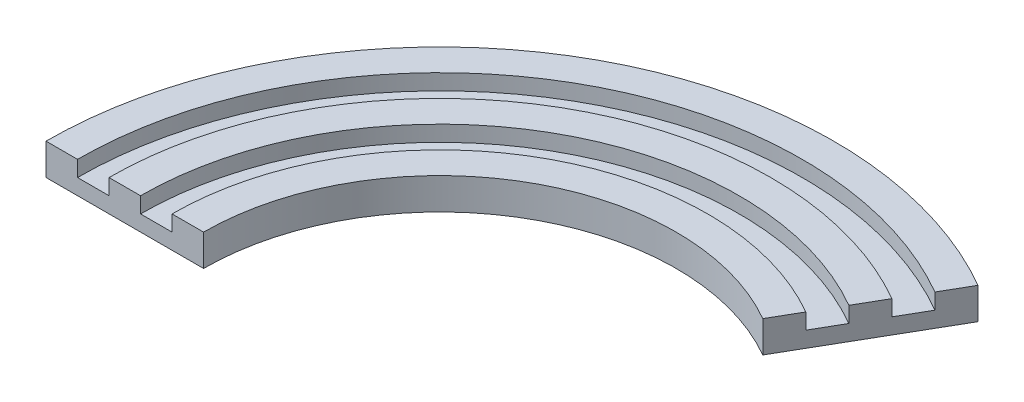
ISO-10303-21;
HEADER;
FILE_DESCRIPTION(('STEP AP214'),'2;1');
FILE_NAME('part.step','',(''),(''),'','','');
FILE_SCHEMA(('AUTOMOTIVE_DESIGN { 1 0 10303 214 1 1 1 1 }'));
ENDSEC;
DATA;
#1=APPLICATION_CONTEXT('core data for automotive mechanical design processes');
#2=APPLICATION_PROTOCOL_DEFINITION('international standard','automotive_design',2000,#1);
#3=PRODUCT_CONTEXT('',#1,'mechanical');
#4=PRODUCT('Part','Part','',(#3));
#5=PRODUCT_RELATED_PRODUCT_CATEGORY('part','',(#4));
#6=PRODUCT_DEFINITION_FORMATION('','',#4);
#7=PRODUCT_DEFINITION_CONTEXT('part definition',#1,'design');
#8=PRODUCT_DEFINITION('design','',#6,#7);
#9=PRODUCT_DEFINITION_SHAPE('','',#8);
#10=(LENGTH_UNIT() NAMED_UNIT(*) SI_UNIT(.MILLI.,.METRE.));
#11=(NAMED_UNIT(*) PLANE_ANGLE_UNIT() SI_UNIT($,.RADIAN.));
#12=(NAMED_UNIT(*) SI_UNIT($,.STERADIAN.) SOLID_ANGLE_UNIT());
#13=UNCERTAINTY_MEASURE_WITH_UNIT(LENGTH_MEASURE(1.E-05),#10,'distance_accuracy_value','');
#14=(GEOMETRIC_REPRESENTATION_CONTEXT(3) GLOBAL_UNCERTAINTY_ASSIGNED_CONTEXT((#13)) GLOBAL_UNIT_ASSIGNED_CONTEXT((#10,
#11,#12)) REPRESENTATION_CONTEXT('',''));
#15=CARTESIAN_POINT('',(0.,0.,0.));
#16=DIRECTION('',(0.,0.,1.));
#17=DIRECTION('',(1.,0.,0.));
#18=AXIS2_PLACEMENT_3D('',#15,#16,#17);
#19=CARTESIAN_POINT('',(0.,0.,0.));
#20=DIRECTION('',(0.,0.,-1.));
#21=DIRECTION('',(-1.,0.,0.));
#22=AXIS2_PLACEMENT_3D('',#19,#20,#21);
#23=PLANE('',#22);
#24=DIRECTION('',(-1.,0.,0.));
#25=VECTOR('',#24,1.);
#26=CARTESIAN_POINT('',(-15.,5.,0.));
#27=LINE('',#26,#25);
#28=CARTESIAN_POINT('',(-15.,5.,0.));
#29=VERTEX_POINT('',#28);
#30=CARTESIAN_POINT('',(-25.,5.,0.));
#31=VERTEX_POINT('',#30);
#32=EDGE_CURVE('E133',#29,#31,#27,.T.);
#33=ORIENTED_EDGE('',*,*,#32,.T.);
#34=DIRECTION('',(0.,-1.,0.));
#35=VECTOR('',#34,1.);
#36=CARTESIAN_POINT('',(-25.,-5.,0.));
#37=LINE('',#36,#35);
#38=CARTESIAN_POINT('',(-25.,-5.,0.));
#39=VERTEX_POINT('',#38);
#40=EDGE_CURVE('E140',#31,#39,#37,.T.);
#41=ORIENTED_EDGE('',*,*,#40,.T.);
#42=DIRECTION('',(1.,0.,0.));
#43=VECTOR('',#42,1.);
#44=CARTESIAN_POINT('',(25.,-4.99999999999999,0.));
#45=LINE('',#44,#43);
#46=CARTESIAN_POINT('',(25.,-4.99999999999999,0.));
#47=VERTEX_POINT('',#46);
#48=EDGE_CURVE('E150',#39,#47,#45,.T.);
#49=ORIENTED_EDGE('',*,*,#48,.T.);
#50=DIRECTION('',(0.,1.,0.));
#51=VECTOR('',#50,1.);
#52=CARTESIAN_POINT('',(25.,-4.99999999999999,0.));
#53=LINE('',#52,#51);
#54=CARTESIAN_POINT('',(25.,5.,0.));
#55=VERTEX_POINT('',#54);
#56=EDGE_CURVE('E159',#47,#55,#53,.T.);
#57=ORIENTED_EDGE('',*,*,#56,.T.);
#58=DIRECTION('',(-1.,0.,0.));
#59=VECTOR('',#58,1.);
#60=CARTESIAN_POINT('',(25.,5.,0.));
#61=LINE('',#60,#59);
#62=CARTESIAN_POINT('',(15.,5.,0.));
#63=VERTEX_POINT('',#62);
#64=EDGE_CURVE('E167',#55,#63,#61,.T.);
#65=ORIENTED_EDGE('',*,*,#64,.T.);
#66=DIRECTION('',(0.,-1.,0.));
#67=VECTOR('',#66,1.);
#68=CARTESIAN_POINT('',(15.,5.,0.));
#69=LINE('',#68,#67);
#70=CARTESIAN_POINT('',(15.,0.,0.));
#71=VERTEX_POINT('',#70);
#72=EDGE_CURVE('E175',#63,#71,#69,.T.);
#73=ORIENTED_EDGE('',*,*,#72,.T.);
#74=DIRECTION('',(-1.,0.,0.));
#75=VECTOR('',#74,1.);
#76=CARTESIAN_POINT('',(15.,0.,0.));
#77=LINE('',#76,#75);
#78=CARTESIAN_POINT('',(5.00000000000001,0.,0.));
#79=VERTEX_POINT('',#78);
#80=EDGE_CURVE('E183',#71,#79,#77,.T.);
#81=ORIENTED_EDGE('',*,*,#80,.T.);
#82=DIRECTION('',(0.,1.,0.));
#83=VECTOR('',#82,1.);
#84=CARTESIAN_POINT('',(5.00000000000001,5.,0.));
#85=LINE('',#84,#83);
#86=CARTESIAN_POINT('',(5.00000000000001,5.,0.));
#87=VERTEX_POINT('',#86);
#88=EDGE_CURVE('E191',#79,#87,#85,.T.);
#89=ORIENTED_EDGE('',*,*,#88,.T.);
#90=DIRECTION('',(-1.,0.,0.));
#91=VECTOR('',#90,1.);
#92=CARTESIAN_POINT('',(5.00000000000001,5.,0.));
#93=LINE('',#92,#91);
#94=CARTESIAN_POINT('',(-4.99999999999999,5.,0.));
#95=VERTEX_POINT('',#94);
#96=EDGE_CURVE('E199',#87,#95,#93,.T.);
#97=ORIENTED_EDGE('',*,*,#96,.T.);
#98=DIRECTION('',(0.,-1.,0.));
#99=VECTOR('',#98,1.);
#100=CARTESIAN_POINT('',(-5.,5.,0.));
#101=LINE('',#100,#99);
#102=CARTESIAN_POINT('',(-4.99999999999999,0.,0.));
#103=VERTEX_POINT('',#102);
#104=EDGE_CURVE('E79',#95,#103,#101,.T.);
#105=ORIENTED_EDGE('',*,*,#104,.T.);
#106=DIRECTION('',(-1.,0.,0.));
#107=VECTOR('',#106,1.);
#108=CARTESIAN_POINT('',(-15.,0.,0.));
#109=LINE('',#108,#107);
#110=CARTESIAN_POINT('',(-15.,0.,0.));
#111=VERTEX_POINT('',#110);
#112=EDGE_CURVE('E74',#103,#111,#109,.T.);
#113=ORIENTED_EDGE('',*,*,#112,.T.);
#114=DIRECTION('',(0.,1.,0.));
#115=VECTOR('',#114,1.);
#116=CARTESIAN_POINT('',(-15.,5.,0.));
#117=LINE('',#116,#115);
#118=EDGE_CURVE('E68',#111,#29,#117,.T.);
#119=ORIENTED_EDGE('',*,*,#118,.T.);
#120=EDGE_LOOP('',(#33,#41,#49,#57,#65,#73,#81,#89,#97,#105,#113,#119));
#121=FACE_BOUND('',#120,.T.);
#122=ADVANCED_FACE('F32',(#121),#23,.F.);
#123=CARTESIAN_POINT('',(150.000000000001,0.,-86.6025403784433));
#124=DIRECTION('',(0.866025403784433,0.,0.50000000000001));
#125=DIRECTION('',(0.50000000000001,0.,-0.866025403784433));
#126=AXIS2_PLACEMENT_3D('',#123,#124,#125);
#127=PLANE('',#126);
#128=DIRECTION('',(0.50000000000001,0.,-0.866025403784433));
#129=VECTOR('',#128,1.);
#130=CARTESIAN_POINT('',(157.500000000001,5.,-99.5929214352098));
#131=LINE('',#130,#129);
#132=CARTESIAN_POINT('',(157.500000000001,5.,-99.5929214352098));
#133=VERTEX_POINT('',#132);
#134=CARTESIAN_POINT('',(162.500000000001,5.,-108.253175473054));
#135=VERTEX_POINT('',#134);
#136=EDGE_CURVE('E144',#133,#135,#131,.T.);
#137=ORIENTED_EDGE('',*,*,#136,.F.);
#138=DIRECTION('',(0.,1.,0.));
#139=VECTOR('',#138,1.);
#140=CARTESIAN_POINT('',(157.500000000001,5.,-99.5929214352098));
#141=LINE('',#140,#139);
#142=CARTESIAN_POINT('',(157.500000000001,0.,-99.5929214352098));
#143=VERTEX_POINT('',#142);
#144=EDGE_CURVE('E11',#143,#133,#141,.T.);
#145=ORIENTED_EDGE('',*,*,#144,.F.);
#146=DIRECTION('',(0.50000000000001,0.,-0.866025403784433));
#147=VECTOR('',#146,1.);
#148=CARTESIAN_POINT('',(157.500000000001,0.,-99.5929214352098));
#149=LINE('',#148,#147);
#150=CARTESIAN_POINT('',(152.500000000001,0.,-90.9326673973654));
#151=VERTEX_POINT('',#150);
#152=EDGE_CURVE('E46',#151,#143,#149,.T.);
#153=ORIENTED_EDGE('',*,*,#152,.F.);
#154=DIRECTION('',(0.,-1.,0.));
#155=VECTOR('',#154,1.);
#156=CARTESIAN_POINT('',(152.500000000001,5.,-90.9326673973654));
#157=LINE('',#156,#155);
#158=CARTESIAN_POINT('',(152.500000000001,5.,-90.9326673973654));
#159=VERTEX_POINT('',#158);
#160=EDGE_CURVE('E55',#159,#151,#157,.T.);
#161=ORIENTED_EDGE('',*,*,#160,.F.);
#162=DIRECTION('',(0.50000000000001,0.,-0.866025403784433));
#163=VECTOR('',#162,1.);
#164=CARTESIAN_POINT('',(147.500000000001,5.,-82.2724133595211));
#165=LINE('',#164,#163);
#166=CARTESIAN_POINT('',(147.500000000001,5.,-82.2724133595211));
#167=VERTEX_POINT('',#166);
#168=EDGE_CURVE('E204',#167,#159,#165,.T.);
#169=ORIENTED_EDGE('',*,*,#168,.F.);
#170=DIRECTION('',(0.,1.,0.));
#171=VECTOR('',#170,1.);
#172=CARTESIAN_POINT('',(147.500000000001,5.,-82.2724133595211));
#173=LINE('',#172,#171);
#174=CARTESIAN_POINT('',(147.500000000001,0.,-82.2724133595211));
#175=VERTEX_POINT('',#174);
#176=EDGE_CURVE('E196',#175,#167,#173,.T.);
#177=ORIENTED_EDGE('',*,*,#176,.F.);
#178=DIRECTION('',(0.50000000000001,0.,-0.866025403784433));
#179=VECTOR('',#178,1.);
#180=CARTESIAN_POINT('',(142.500000000001,0.,-73.6121593216768));
#181=LINE('',#180,#179);
#182=CARTESIAN_POINT('',(142.500000000001,0.,-73.6121593216768));
#183=VERTEX_POINT('',#182);
#184=EDGE_CURVE('E188',#183,#175,#181,.T.);
#185=ORIENTED_EDGE('',*,*,#184,.F.);
#186=DIRECTION('',(0.,-1.,0.));
#187=VECTOR('',#186,1.);
#188=CARTESIAN_POINT('',(142.500000000001,5.,-73.6121593216768));
#189=LINE('',#188,#187);
#190=CARTESIAN_POINT('',(142.500000000001,5.,-73.6121593216768));
#191=VERTEX_POINT('',#190);
#192=EDGE_CURVE('E180',#191,#183,#189,.T.);
#193=ORIENTED_EDGE('',*,*,#192,.F.);
#194=DIRECTION('',(0.50000000000001,0.,-0.866025403784433));
#195=VECTOR('',#194,1.);
#196=CARTESIAN_POINT('',(137.500000000001,5.,-64.9519052838325));
#197=LINE('',#196,#195);
#198=CARTESIAN_POINT('',(137.500000000001,5.,-64.9519052838325));
#199=VERTEX_POINT('',#198);
#200=EDGE_CURVE('E172',#199,#191,#197,.T.);
#201=ORIENTED_EDGE('',*,*,#200,.F.);
#202=DIRECTION('',(0.,1.,0.));
#203=VECTOR('',#202,1.);
#204=CARTESIAN_POINT('',(137.500000000001,-4.99999999999999,-64.9519052838325));
#205=LINE('',#204,#203);
#206=CARTESIAN_POINT('',(137.500000000001,-4.99999999999999,-64.9519052838325));
#207=VERTEX_POINT('',#206);
#208=EDGE_CURVE('E164',#207,#199,#205,.T.);
#209=ORIENTED_EDGE('',*,*,#208,.F.);
#210=DIRECTION('',(-0.50000000000001,0.,0.866025403784433));
#211=VECTOR('',#210,1.);
#212=CARTESIAN_POINT('',(137.500000000001,-4.99999999999999,-64.9519052838325));
#213=LINE('',#212,#211);
#214=CARTESIAN_POINT('',(162.500000000001,-5.,-108.253175473054));
#215=VERTEX_POINT('',#214);
#216=EDGE_CURVE('E156',#215,#207,#213,.T.);
#217=ORIENTED_EDGE('',*,*,#216,.F.);
#218=DIRECTION('',(0.,-1.,0.));
#219=VECTOR('',#218,1.);
#220=CARTESIAN_POINT('',(162.500000000001,-5.,-108.253175473054));
#221=LINE('',#220,#219);
#222=EDGE_CURVE('E151',#135,#215,#221,.T.);
#223=ORIENTED_EDGE('',*,*,#222,.F.);
#224=EDGE_LOOP('',(#137,#145,#153,#161,#169,#177,#185,#193,#201,#209,#217,#223));
#225=FACE_BOUND('',#224,.T.);
#226=ADVANCED_FACE('F227',(#225),#127,.T.);
#227=CARTESIAN_POINT('',(-15.,5.,0.));
#228=DIRECTION('',(0.,-1.,0.));
#229=DIRECTION('',(0.,0.,-1.));
#230=AXIS2_PLACEMENT_3D('',#227,#228,#229);
#231=PLANE('',#230);
#232=CARTESIAN_POINT('',(100.,5.,0.));
#233=DIRECTION('',(0.,-1.,0.));
#234=DIRECTION('',(-1.,0.,0.));
#235=AXIS2_PLACEMENT_3D('',#232,#233,#234);
#236=CIRCLE('',#235,125.);
#237=EDGE_CURVE('E137',#31,#135,#236,.T.);
#238=ORIENTED_EDGE('',*,*,#237,.F.);
#239=ORIENTED_EDGE('',*,*,#32,.F.);
#240=CARTESIAN_POINT('',(100.,5.,0.));
#241=DIRECTION('',(0.,-1.,0.));
#242=DIRECTION('',(-1.,0.,0.));
#243=AXIS2_PLACEMENT_3D('',#240,#241,#242);
#244=CIRCLE('',#243,115.);
#245=EDGE_CURVE('E135',#29,#133,#244,.T.);
#246=ORIENTED_EDGE('',*,*,#245,.T.);
#247=ORIENTED_EDGE('',*,*,#136,.T.);
#248=EDGE_LOOP('',(#238,#239,#246,#247));
#249=FACE_BOUND('',#248,.T.);
#250=ADVANCED_FACE('F134',(#249),#231,.F.);
#251=CARTESIAN_POINT('',(100.,0.,0.));
#252=DIRECTION('',(0.,-1.,0.));
#253=DIRECTION('',(0.,0.,-1.));
#254=AXIS2_PLACEMENT_3D('',#251,#252,#253);
#255=CYLINDRICAL_SURFACE('',#254,125.);
#256=CARTESIAN_POINT('',(100.,-5.,0.));
#257=DIRECTION('',(0.,-1.,0.));
#258=DIRECTION('',(-1.,0.,0.));
#259=AXIS2_PLACEMENT_3D('',#256,#257,#258);
#260=CIRCLE('',#259,125.);
#261=EDGE_CURVE('E153',#39,#215,#260,.T.);
#262=ORIENTED_EDGE('',*,*,#261,.F.);
#263=ORIENTED_EDGE('',*,*,#40,.F.);
#264=ORIENTED_EDGE('',*,*,#237,.T.);
#265=ORIENTED_EDGE('',*,*,#222,.T.);
#266=EDGE_LOOP('',(#262,#263,#264,#265));
#267=FACE_BOUND('',#266,.T.);
#268=ADVANCED_FACE('F234',(#267),#255,.T.);
#269=CARTESIAN_POINT('',(25.,-5.,0.));
#270=DIRECTION('',(0.,1.,0.));
#271=DIRECTION('',(0.,0.,1.));
#272=AXIS2_PLACEMENT_3D('',#269,#270,#271);
#273=PLANE('',#272);
#274=CARTESIAN_POINT('',(100.,-4.99999999999999,0.));
#275=DIRECTION('',(0.,-1.,0.));
#276=DIRECTION('',(-1.,0.,0.));
#277=AXIS2_PLACEMENT_3D('',#274,#275,#276);
#278=CIRCLE('',#277,75.);
#279=EDGE_CURVE('E161',#47,#207,#278,.T.);
#280=ORIENTED_EDGE('',*,*,#279,.F.);
#281=ORIENTED_EDGE('',*,*,#48,.F.);
#282=ORIENTED_EDGE('',*,*,#261,.T.);
#283=ORIENTED_EDGE('',*,*,#216,.T.);
#284=EDGE_LOOP('',(#280,#281,#282,#283));
#285=FACE_BOUND('',#284,.T.);
#286=ADVANCED_FACE('F244',(#285),#273,.F.);
#287=CARTESIAN_POINT('',(100.,0.,0.));
#288=DIRECTION('',(0.,-1.,0.));
#289=DIRECTION('',(0.,0.,-1.));
#290=AXIS2_PLACEMENT_3D('',#287,#288,#289);
#291=CYLINDRICAL_SURFACE('',#290,75.);
#292=CARTESIAN_POINT('',(100.,5.,0.));
#293=DIRECTION('',(0.,-1.,0.));
#294=DIRECTION('',(-1.,0.,0.));
#295=AXIS2_PLACEMENT_3D('',#292,#293,#294);
#296=CIRCLE('',#295,75.);
#297=EDGE_CURVE('E169',#55,#199,#296,.T.);
#298=ORIENTED_EDGE('',*,*,#297,.F.);
#299=ORIENTED_EDGE('',*,*,#56,.F.);
#300=ORIENTED_EDGE('',*,*,#279,.T.);
#301=ORIENTED_EDGE('',*,*,#208,.T.);
#302=EDGE_LOOP('',(#298,#299,#300,#301));
#303=FACE_BOUND('',#302,.T.);
#304=ADVANCED_FACE('F246',(#303),#291,.F.);
#305=CARTESIAN_POINT('',(25.,5.,0.));
#306=DIRECTION('',(0.,-1.,0.));
#307=DIRECTION('',(0.,0.,-1.));
#308=AXIS2_PLACEMENT_3D('',#305,#306,#307);
#309=PLANE('',#308);
#310=CARTESIAN_POINT('',(100.,5.,0.));
#311=DIRECTION('',(0.,-1.,0.));
#312=DIRECTION('',(-1.,0.,0.));
#313=AXIS2_PLACEMENT_3D('',#310,#311,#312);
#314=CIRCLE('',#313,85.);
#315=EDGE_CURVE('E177',#63,#191,#314,.T.);
#316=ORIENTED_EDGE('',*,*,#315,.F.);
#317=ORIENTED_EDGE('',*,*,#64,.F.);
#318=ORIENTED_EDGE('',*,*,#297,.T.);
#319=ORIENTED_EDGE('',*,*,#200,.T.);
#320=EDGE_LOOP('',(#316,#317,#318,#319));
#321=FACE_BOUND('',#320,.T.);
#322=ADVANCED_FACE('F250',(#321),#309,.F.);
#323=CARTESIAN_POINT('',(100.,0.,0.));
#324=DIRECTION('',(0.,-1.,0.));
#325=DIRECTION('',(0.,0.,-1.));
#326=AXIS2_PLACEMENT_3D('',#323,#324,#325);
#327=CYLINDRICAL_SURFACE('',#326,85.);
#328=CARTESIAN_POINT('',(100.,0.,0.));
#329=DIRECTION('',(0.,-1.,0.));
#330=DIRECTION('',(-1.,0.,0.));
#331=AXIS2_PLACEMENT_3D('',#328,#329,#330);
#332=CIRCLE('',#331,85.);
#333=EDGE_CURVE('E185',#71,#183,#332,.T.);
#334=ORIENTED_EDGE('',*,*,#333,.F.);
#335=ORIENTED_EDGE('',*,*,#72,.F.);
#336=ORIENTED_EDGE('',*,*,#315,.T.);
#337=ORIENTED_EDGE('',*,*,#192,.T.);
#338=EDGE_LOOP('',(#334,#335,#336,#337));
#339=FACE_BOUND('',#338,.T.);
#340=ADVANCED_FACE('F255',(#339),#327,.T.);
#341=CARTESIAN_POINT('',(15.,0.,0.));
#342=DIRECTION('',(0.,-1.,0.));
#343=DIRECTION('',(0.,0.,-1.));
#344=AXIS2_PLACEMENT_3D('',#341,#342,#343);
#345=PLANE('',#344);
#346=CARTESIAN_POINT('',(100.,0.,0.));
#347=DIRECTION('',(0.,-1.,0.));
#348=DIRECTION('',(-1.,0.,0.));
#349=AXIS2_PLACEMENT_3D('',#346,#347,#348);
#350=CIRCLE('',#349,95.);
#351=EDGE_CURVE('E193',#79,#175,#350,.T.);
#352=ORIENTED_EDGE('',*,*,#351,.F.);
#353=ORIENTED_EDGE('',*,*,#80,.F.);
#354=ORIENTED_EDGE('',*,*,#333,.T.);
#355=ORIENTED_EDGE('',*,*,#184,.T.);
#356=EDGE_LOOP('',(#352,#353,#354,#355));
#357=FACE_BOUND('',#356,.T.);
#358=ADVANCED_FACE('F258',(#357),#345,.F.);
#359=CARTESIAN_POINT('',(100.,0.,0.));
#360=DIRECTION('',(0.,-1.,0.));
#361=DIRECTION('',(0.,0.,-1.));
#362=AXIS2_PLACEMENT_3D('',#359,#360,#361);
#363=CYLINDRICAL_SURFACE('',#362,95.);
#364=CARTESIAN_POINT('',(100.,5.,0.));
#365=DIRECTION('',(0.,-1.,0.));
#366=DIRECTION('',(-1.,0.,0.));
#367=AXIS2_PLACEMENT_3D('',#364,#365,#366);
#368=CIRCLE('',#367,95.);
#369=EDGE_CURVE('E201',#87,#167,#368,.T.);
#370=ORIENTED_EDGE('',*,*,#369,.F.);
#371=ORIENTED_EDGE('',*,*,#88,.F.);
#372=ORIENTED_EDGE('',*,*,#351,.T.);
#373=ORIENTED_EDGE('',*,*,#176,.T.);
#374=EDGE_LOOP('',(#370,#371,#372,#373));
#375=FACE_BOUND('',#374,.T.);
#376=ADVANCED_FACE('F262',(#375),#363,.F.);
#377=CARTESIAN_POINT('',(5.00000000000001,5.,0.));
#378=DIRECTION('',(0.,-1.,0.));
#379=DIRECTION('',(0.,0.,-1.));
#380=AXIS2_PLACEMENT_3D('',#377,#378,#379);
#381=PLANE('',#380);
#382=CARTESIAN_POINT('',(100.,5.,0.));
#383=DIRECTION('',(0.,-1.,0.));
#384=DIRECTION('',(-1.,0.,0.));
#385=AXIS2_PLACEMENT_3D('',#382,#383,#384);
#386=CIRCLE('',#385,105.);
#387=EDGE_CURVE('E207',#95,#159,#386,.T.);
#388=ORIENTED_EDGE('',*,*,#387,.F.);
#389=ORIENTED_EDGE('',*,*,#96,.F.);
#390=ORIENTED_EDGE('',*,*,#369,.T.);
#391=ORIENTED_EDGE('',*,*,#168,.T.);
#392=EDGE_LOOP('',(#388,#389,#390,#391));
#393=FACE_BOUND('',#392,.T.);
#394=ADVANCED_FACE('F224',(#393),#381,.F.);
#395=CARTESIAN_POINT('',(100.,0.,0.));
#396=DIRECTION('',(0.,-1.,0.));
#397=DIRECTION('',(0.,0.,-1.));
#398=AXIS2_PLACEMENT_3D('',#395,#396,#397);
#399=CYLINDRICAL_SURFACE('',#398,105.);
#400=CARTESIAN_POINT('',(100.,0.,0.));
#401=DIRECTION('',(0.,-1.,0.));
#402=DIRECTION('',(-1.,0.,0.));
#403=AXIS2_PLACEMENT_3D('',#400,#401,#402);
#404=CIRCLE('',#403,105.);
#405=EDGE_CURVE('E211',#103,#151,#404,.T.);
#406=ORIENTED_EDGE('',*,*,#405,.F.);
#407=ORIENTED_EDGE('',*,*,#104,.F.);
#408=ORIENTED_EDGE('',*,*,#387,.T.);
#409=ORIENTED_EDGE('',*,*,#160,.T.);
#410=EDGE_LOOP('',(#406,#407,#408,#409));
#411=FACE_BOUND('',#410,.T.);
#412=ADVANCED_FACE('F217',(#411),#399,.T.);
#413=CARTESIAN_POINT('',(-15.,0.,0.));
#414=DIRECTION('',(0.,-1.,0.));
#415=DIRECTION('',(0.,0.,-1.));
#416=AXIS2_PLACEMENT_3D('',#413,#414,#415);
#417=PLANE('',#416);
#418=CARTESIAN_POINT('',(100.,0.,0.));
#419=DIRECTION('',(0.,-1.,0.));
#420=DIRECTION('',(-1.,0.,0.));
#421=AXIS2_PLACEMENT_3D('',#418,#419,#420);
#422=CIRCLE('',#421,115.);
#423=EDGE_CURVE('E39',#111,#143,#422,.T.);
#424=ORIENTED_EDGE('',*,*,#423,.F.);
#425=ORIENTED_EDGE('',*,*,#112,.F.);
#426=ORIENTED_EDGE('',*,*,#405,.T.);
#427=ORIENTED_EDGE('',*,*,#152,.T.);
#428=EDGE_LOOP('',(#424,#425,#426,#427));
#429=FACE_BOUND('',#428,.T.);
#430=ADVANCED_FACE('F215',(#429),#417,.F.);
#431=CARTESIAN_POINT('',(100.,0.,0.));
#432=DIRECTION('',(0.,-1.,0.));
#433=DIRECTION('',(0.,0.,-1.));
#434=AXIS2_PLACEMENT_3D('',#431,#432,#433);
#435=CYLINDRICAL_SURFACE('',#434,115.);
#436=ORIENTED_EDGE('',*,*,#144,.T.);
#437=ORIENTED_EDGE('',*,*,#245,.F.);
#438=ORIENTED_EDGE('',*,*,#118,.F.);
#439=ORIENTED_EDGE('',*,*,#423,.T.);
#440=EDGE_LOOP('',(#436,#437,#438,#439));
#441=FACE_BOUND('',#440,.T.);
#442=ADVANCED_FACE('F142',(#441),#435,.F.);
#443=CLOSED_SHELL('',(#122,#226,#250,#268,#286,#304,#322,#340,#358,#376,#394,#412,#430,#442));
#444=MANIFOLD_SOLID_BREP('B2',#443);
#445=ADVANCED_BREP_SHAPE_REPRESENTATION('',(#18,#444),#14);
#446=SHAPE_DEFINITION_REPRESENTATION(#9,#445);
ENDSEC;
END-ISO-10303-21;
